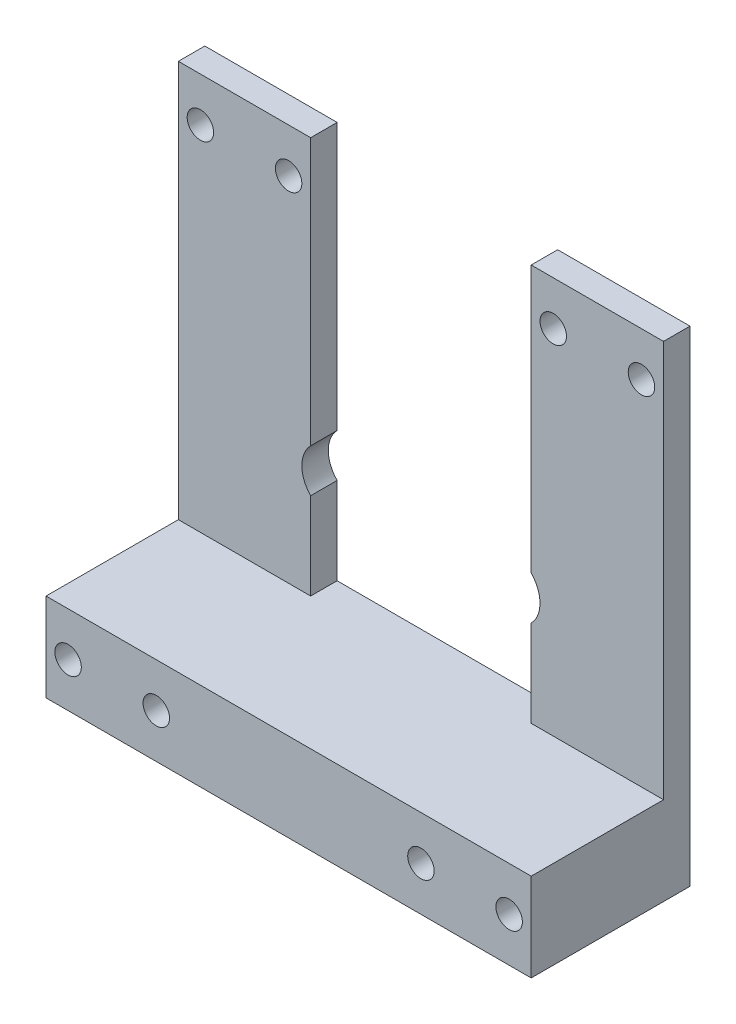
ISO-10303-21;
HEADER;
FILE_DESCRIPTION(('STEP AP214'),'2;1');
FILE_NAME('part.step','',(''),(''),'','','');
FILE_SCHEMA(('AUTOMOTIVE_DESIGN { 1 0 10303 214 1 1 1 1 }'));
ENDSEC;
DATA;
#1=APPLICATION_CONTEXT('core data for automotive mechanical design processes');
#2=APPLICATION_PROTOCOL_DEFINITION('international standard','automotive_design',2000,#1);
#3=PRODUCT_CONTEXT('',#1,'mechanical');
#4=PRODUCT('Part','Part','',(#3));
#5=PRODUCT_RELATED_PRODUCT_CATEGORY('part','',(#4));
#6=PRODUCT_DEFINITION_FORMATION('','',#4);
#7=PRODUCT_DEFINITION_CONTEXT('part definition',#1,'design');
#8=PRODUCT_DEFINITION('design','',#6,#7);
#9=PRODUCT_DEFINITION_SHAPE('','',#8);
#10=(LENGTH_UNIT() NAMED_UNIT(*) SI_UNIT(.MILLI.,.METRE.));
#11=(NAMED_UNIT(*) PLANE_ANGLE_UNIT() SI_UNIT($,.RADIAN.));
#12=(NAMED_UNIT(*) SI_UNIT($,.STERADIAN.) SOLID_ANGLE_UNIT());
#13=UNCERTAINTY_MEASURE_WITH_UNIT(LENGTH_MEASURE(1.E-05),#10,'distance_accuracy_value','');
#14=(GEOMETRIC_REPRESENTATION_CONTEXT(3) GLOBAL_UNCERTAINTY_ASSIGNED_CONTEXT((#13)) GLOBAL_UNIT_ASSIGNED_CONTEXT((#10,
#11,#12)) REPRESENTATION_CONTEXT('',''));
#15=CARTESIAN_POINT('',(0.,0.,0.));
#16=DIRECTION('',(0.,0.,1.));
#17=DIRECTION('',(1.,0.,0.));
#18=AXIS2_PLACEMENT_3D('',#15,#16,#17);
#19=CARTESIAN_POINT('',(0.,0.,15.));
#20=DIRECTION('',(0.,0.,1.));
#21=DIRECTION('',(1.,0.,0.));
#22=AXIS2_PLACEMENT_3D('',#19,#20,#21);
#23=PLANE('',#22);
#24=CARTESIAN_POINT('',(-42.5,5.,15.));
#25=DIRECTION('',(0.,0.,1.));
#26=DIRECTION('',(1.,0.,0.));
#27=AXIS2_PLACEMENT_3D('',#24,#25,#26);
#28=CIRCLE('',#27,1.5);
#29=CARTESIAN_POINT('',(-41.,5.,15.));
#30=VERTEX_POINT('',#29);
#31=EDGE_CURVE('E323',#30,#30,#28,.T.);
#32=ORIENTED_EDGE('',*,*,#31,.F.);
#33=EDGE_LOOP('',(#32));
#34=FACE_BOUND('',#33,.T.);
#35=CARTESIAN_POINT('',(-2.5,4.99999999999983,15.));
#36=DIRECTION('',(0.,0.,1.));
#37=DIRECTION('',(1.,0.,0.));
#38=AXIS2_PLACEMENT_3D('',#35,#36,#37);
#39=CIRCLE('',#38,1.5);
#40=CARTESIAN_POINT('',(-0.999999999999995,4.99999999999983,15.));
#41=VERTEX_POINT('',#40);
#42=EDGE_CURVE('E331',#41,#41,#39,.T.);
#43=ORIENTED_EDGE('',*,*,#42,.F.);
#44=EDGE_LOOP('',(#43));
#45=FACE_BOUND('',#44,.T.);
#46=DIRECTION('',(0.,1.,0.));
#47=VECTOR('',#46,1.);
#48=CARTESIAN_POINT('',(0.,0.,15.));
#49=LINE('',#48,#47);
#50=CARTESIAN_POINT('',(0.,0.,15.));
#51=VERTEX_POINT('',#50);
#52=CARTESIAN_POINT('',(0.,10.,15.));
#53=VERTEX_POINT('',#52);
#54=EDGE_CURVE('E336',#51,#53,#49,.T.);
#55=ORIENTED_EDGE('',*,*,#54,.T.);
#56=DIRECTION('',(-1.,0.,0.));
#57=VECTOR('',#56,1.);
#58=CARTESIAN_POINT('',(0.,10.,15.));
#59=LINE('',#58,#57);
#60=CARTESIAN_POINT('',(-55.,10.,15.));
#61=VERTEX_POINT('',#60);
#62=EDGE_CURVE('E339',#53,#61,#59,.T.);
#63=ORIENTED_EDGE('',*,*,#62,.T.);
#64=DIRECTION('',(0.,-1.,0.));
#65=VECTOR('',#64,1.);
#66=CARTESIAN_POINT('',(-55.,0.,15.));
#67=LINE('',#66,#65);
#68=CARTESIAN_POINT('',(-55.,0.,15.));
#69=VERTEX_POINT('',#68);
#70=EDGE_CURVE('E343',#61,#69,#67,.T.);
#71=ORIENTED_EDGE('',*,*,#70,.T.);
#72=DIRECTION('',(1.,0.,0.));
#73=VECTOR('',#72,1.);
#74=CARTESIAN_POINT('',(0.,0.,15.));
#75=LINE('',#74,#73);
#76=EDGE_CURVE('E68',#69,#51,#75,.T.);
#77=ORIENTED_EDGE('',*,*,#76,.T.);
#78=EDGE_LOOP('',(#55,#63,#71,#77));
#79=FACE_BOUND('',#78,.T.);
#80=CARTESIAN_POINT('',(-12.5,4.9999999999999,15.));
#81=DIRECTION('',(0.,0.,1.));
#82=DIRECTION('',(1.,0.,0.));
#83=AXIS2_PLACEMENT_3D('',#80,#81,#82);
#84=CIRCLE('',#83,1.5);
#85=CARTESIAN_POINT('',(-11.,4.9999999999999,15.));
#86=VERTEX_POINT('',#85);
#87=EDGE_CURVE('E327',#86,#86,#84,.T.);
#88=ORIENTED_EDGE('',*,*,#87,.F.);
#89=EDGE_LOOP('',(#88));
#90=FACE_BOUND('',#89,.T.);
#91=CARTESIAN_POINT('',(-52.5,5.,15.));
#92=DIRECTION('',(0.,0.,1.));
#93=DIRECTION('',(1.,0.,0.));
#94=AXIS2_PLACEMENT_3D('',#91,#92,#93);
#95=CIRCLE('',#94,1.5);
#96=CARTESIAN_POINT('',(-51.,5.,15.));
#97=VERTEX_POINT('',#96);
#98=EDGE_CURVE('E319',#97,#97,#95,.T.);
#99=ORIENTED_EDGE('',*,*,#98,.F.);
#100=EDGE_LOOP('',(#99));
#101=FACE_BOUND('',#100,.T.);
#102=ADVANCED_FACE('F51',(#34,#45,#79,#90,#101),#23,.T.);
#103=CARTESIAN_POINT('',(0.,0.,15.));
#104=DIRECTION('',(-1.,0.,0.));
#105=DIRECTION('',(0.,0.,1.));
#106=AXIS2_PLACEMENT_3D('',#103,#104,#105);
#107=PLANE('',#106);
#108=DIRECTION('',(0.,0.,-1.));
#109=VECTOR('',#108,1.);
#110=CARTESIAN_POINT('',(0.,0.,15.));
#111=LINE('',#110,#109);
#112=CARTESIAN_POINT('',(0.,0.,-3.));
#113=VERTEX_POINT('',#112);
#114=EDGE_CURVE('E157',#51,#113,#111,.T.);
#115=ORIENTED_EDGE('',*,*,#114,.T.);
#116=DIRECTION('',(0.,-1.,0.));
#117=VECTOR('',#116,1.);
#118=CARTESIAN_POINT('',(0.,0.,-3.));
#119=LINE('',#118,#117);
#120=CARTESIAN_POINT('',(0.,54.9999999999979,-3.));
#121=VERTEX_POINT('',#120);
#122=EDGE_CURVE('E175',#121,#113,#119,.T.);
#123=ORIENTED_EDGE('',*,*,#122,.F.);
#124=DIRECTION('',(0.,0.,1.));
#125=VECTOR('',#124,1.);
#126=CARTESIAN_POINT('',(0.,54.9999999999979,-3.));
#127=LINE('',#126,#125);
#128=CARTESIAN_POINT('',(0.,54.9999999999979,0.));
#129=VERTEX_POINT('',#128);
#130=EDGE_CURVE('E246',#121,#129,#127,.T.);
#131=ORIENTED_EDGE('',*,*,#130,.T.);
#132=DIRECTION('',(0.,-1.,0.));
#133=VECTOR('',#132,1.);
#134=CARTESIAN_POINT('',(0.,0.,0.));
#135=LINE('',#134,#133);
#136=CARTESIAN_POINT('',(0.,10.,0.));
#137=VERTEX_POINT('',#136);
#138=EDGE_CURVE('E276',#129,#137,#135,.T.);
#139=ORIENTED_EDGE('',*,*,#138,.T.);
#140=DIRECTION('',(0.,0.,-1.));
#141=VECTOR('',#140,1.);
#142=CARTESIAN_POINT('',(0.,10.,15.));
#143=LINE('',#142,#141);
#144=EDGE_CURVE('E11',#53,#137,#143,.T.);
#145=ORIENTED_EDGE('',*,*,#144,.F.);
#146=ORIENTED_EDGE('',*,*,#54,.F.);
#147=EDGE_LOOP('',(#115,#123,#131,#139,#145,#146));
#148=FACE_BOUND('',#147,.T.);
#149=ADVANCED_FACE('F53',(#148),#107,.F.);
#150=CARTESIAN_POINT('',(0.,10.,15.));
#151=DIRECTION('',(0.,-1.,0.));
#152=DIRECTION('',(1.,0.,0.));
#153=AXIS2_PLACEMENT_3D('',#150,#151,#152);
#154=PLANE('',#153);
#155=DIRECTION('',(-1.,0.,0.));
#156=VECTOR('',#155,1.);
#157=CARTESIAN_POINT('',(0.,10.,0.));
#158=LINE('',#157,#156);
#159=CARTESIAN_POINT('',(-15.0000000000012,10.,0.));
#160=VERTEX_POINT('',#159);
#161=EDGE_CURVE('E340',#137,#160,#158,.T.);
#162=ORIENTED_EDGE('',*,*,#161,.T.);
#163=DIRECTION('',(0.,0.,1.));
#164=VECTOR('',#163,1.);
#165=CARTESIAN_POINT('',(-15.0000000000012,10.,-3.));
#166=LINE('',#165,#164);
#167=CARTESIAN_POINT('',(-15.0000000000012,10.,-3.));
#168=VERTEX_POINT('',#167);
#169=EDGE_CURVE('E301',#168,#160,#166,.T.);
#170=ORIENTED_EDGE('',*,*,#169,.F.);
#171=DIRECTION('',(1.,0.,0.));
#172=VECTOR('',#171,1.);
#173=CARTESIAN_POINT('',(0.,10.,-3.));
#174=LINE('',#173,#172);
#175=CARTESIAN_POINT('',(-40.0000000000012,10.,-3.));
#176=VERTEX_POINT('',#175);
#177=EDGE_CURVE('E198',#176,#168,#174,.T.);
#178=ORIENTED_EDGE('',*,*,#177,.F.);
#179=DIRECTION('',(0.,0.,1.));
#180=VECTOR('',#179,1.);
#181=CARTESIAN_POINT('',(-40.0000000000012,10.,-3.));
#182=LINE('',#181,#180);
#183=CARTESIAN_POINT('',(-40.0000000000012,10.,0.));
#184=VERTEX_POINT('',#183);
#185=EDGE_CURVE('E304',#176,#184,#182,.T.);
#186=ORIENTED_EDGE('',*,*,#185,.T.);
#187=CARTESIAN_POINT('',(-55.,10.,0.));
#188=VERTEX_POINT('',#187);
#189=EDGE_CURVE('E335',#184,#188,#158,.T.);
#190=ORIENTED_EDGE('',*,*,#189,.T.);
#191=DIRECTION('',(0.,0.,-1.));
#192=VECTOR('',#191,1.);
#193=CARTESIAN_POINT('',(-55.,10.,15.));
#194=LINE('',#193,#192);
#195=EDGE_CURVE('E61',#61,#188,#194,.T.);
#196=ORIENTED_EDGE('',*,*,#195,.F.);
#197=ORIENTED_EDGE('',*,*,#62,.F.);
#198=ORIENTED_EDGE('',*,*,#144,.T.);
#199=EDGE_LOOP('',(#162,#170,#178,#186,#190,#196,#197,#198));
#200=FACE_BOUND('',#199,.T.);
#201=ADVANCED_FACE('F359',(#200),#154,.F.);
#202=CARTESIAN_POINT('',(-55.,0.,15.));
#203=DIRECTION('',(1.,0.,0.));
#204=DIRECTION('',(0.,0.,-1.));
#205=AXIS2_PLACEMENT_3D('',#202,#203,#204);
#206=PLANE('',#205);
#207=ORIENTED_EDGE('',*,*,#195,.T.);
#208=DIRECTION('',(0.,1.,0.));
#209=VECTOR('',#208,1.);
#210=CARTESIAN_POINT('',(-55.,0.,0.));
#211=LINE('',#210,#209);
#212=CARTESIAN_POINT('',(-55.,54.9999999999974,0.));
#213=VERTEX_POINT('',#212);
#214=EDGE_CURVE('E247',#188,#213,#211,.T.);
#215=ORIENTED_EDGE('',*,*,#214,.T.);
#216=DIRECTION('',(0.,0.,1.));
#217=VECTOR('',#216,1.);
#218=CARTESIAN_POINT('',(-55.,54.9999999999974,-3.));
#219=LINE('',#218,#217);
#220=CARTESIAN_POINT('',(-55.,54.9999999999974,-3.));
#221=VERTEX_POINT('',#220);
#222=EDGE_CURVE('E164',#221,#213,#219,.T.);
#223=ORIENTED_EDGE('',*,*,#222,.F.);
#224=DIRECTION('',(0.,1.,0.));
#225=VECTOR('',#224,1.);
#226=CARTESIAN_POINT('',(-55.,0.,-3.));
#227=LINE('',#226,#225);
#228=CARTESIAN_POINT('',(-55.,0.,-3.));
#229=VERTEX_POINT('',#228);
#230=EDGE_CURVE('E160',#229,#221,#227,.T.);
#231=ORIENTED_EDGE('',*,*,#230,.F.);
#232=DIRECTION('',(0.,0.,-1.));
#233=VECTOR('',#232,1.);
#234=CARTESIAN_POINT('',(-55.,0.,15.));
#235=LINE('',#234,#233);
#236=EDGE_CURVE('E149',#69,#229,#235,.T.);
#237=ORIENTED_EDGE('',*,*,#236,.F.);
#238=ORIENTED_EDGE('',*,*,#70,.F.);
#239=EDGE_LOOP('',(#207,#215,#223,#231,#237,#238));
#240=FACE_BOUND('',#239,.T.);
#241=ADVANCED_FACE('F162',(#240),#206,.F.);
#242=CARTESIAN_POINT('',(0.,0.,15.));
#243=DIRECTION('',(0.,1.,0.));
#244=DIRECTION('',(0.,0.,1.));
#245=AXIS2_PLACEMENT_3D('',#242,#243,#244);
#246=PLANE('',#245);
#247=ORIENTED_EDGE('',*,*,#236,.T.);
#248=DIRECTION('',(-1.,0.,0.));
#249=VECTOR('',#248,1.);
#250=CARTESIAN_POINT('',(0.,0.,-3.));
#251=LINE('',#250,#249);
#252=EDGE_CURVE('E153',#113,#229,#251,.T.);
#253=ORIENTED_EDGE('',*,*,#252,.F.);
#254=ORIENTED_EDGE('',*,*,#114,.F.);
#255=ORIENTED_EDGE('',*,*,#76,.F.);
#256=EDGE_LOOP('',(#247,#253,#254,#255));
#257=FACE_BOUND('',#256,.T.);
#258=ADVANCED_FACE('F151',(#257),#246,.F.);
#259=CARTESIAN_POINT('',(-2.5,4.99999999999983,15.));
#260=DIRECTION('',(0.,0.,-1.));
#261=DIRECTION('',(-1.,0.,0.));
#262=AXIS2_PLACEMENT_3D('',#259,#260,#261);
#263=CYLINDRICAL_SURFACE('',#262,1.5);
#264=ORIENTED_EDGE('',*,*,#42,.T.);
#265=EDGE_LOOP('',(#264));
#266=FACE_BOUND('',#265,.T.);
#267=CARTESIAN_POINT('',(-2.5,4.99999999999983,-3.));
#268=DIRECTION('',(0.,0.,-1.));
#269=DIRECTION('',(-1.,0.,0.));
#270=AXIS2_PLACEMENT_3D('',#267,#268,#269);
#271=CIRCLE('',#270,1.5);
#272=CARTESIAN_POINT('',(-4.,4.99999999999983,-3.));
#273=VERTEX_POINT('',#272);
#274=EDGE_CURVE('E219',#273,#273,#271,.F.);
#275=ORIENTED_EDGE('',*,*,#274,.F.);
#276=EDGE_LOOP('',(#275));
#277=FACE_BOUND('',#276,.T.);
#278=ADVANCED_FACE('F526',(#266,#277),#263,.F.);
#279=CARTESIAN_POINT('',(-12.5,4.9999999999999,15.));
#280=DIRECTION('',(0.,0.,-1.));
#281=DIRECTION('',(-1.,0.,0.));
#282=AXIS2_PLACEMENT_3D('',#279,#280,#281);
#283=CYLINDRICAL_SURFACE('',#282,1.5);
#284=ORIENTED_EDGE('',*,*,#87,.T.);
#285=EDGE_LOOP('',(#284));
#286=FACE_BOUND('',#285,.T.);
#287=CARTESIAN_POINT('',(-12.5,4.9999999999999,-3.));
#288=DIRECTION('',(0.,0.,-1.));
#289=DIRECTION('',(-1.,0.,0.));
#290=AXIS2_PLACEMENT_3D('',#287,#288,#289);
#291=CIRCLE('',#290,1.5);
#292=CARTESIAN_POINT('',(-14.,4.9999999999999,-3.));
#293=VERTEX_POINT('',#292);
#294=EDGE_CURVE('E215',#293,#293,#291,.F.);
#295=ORIENTED_EDGE('',*,*,#294,.F.);
#296=EDGE_LOOP('',(#295));
#297=FACE_BOUND('',#296,.T.);
#298=ADVANCED_FACE('F522',(#286,#297),#283,.F.);
#299=CARTESIAN_POINT('',(-42.5,5.,15.));
#300=DIRECTION('',(0.,0.,-1.));
#301=DIRECTION('',(-1.,0.,0.));
#302=AXIS2_PLACEMENT_3D('',#299,#300,#301);
#303=CYLINDRICAL_SURFACE('',#302,1.5);
#304=ORIENTED_EDGE('',*,*,#31,.T.);
#305=EDGE_LOOP('',(#304));
#306=FACE_BOUND('',#305,.T.);
#307=CARTESIAN_POINT('',(-42.5,5.,-3.));
#308=DIRECTION('',(0.,0.,-1.));
#309=DIRECTION('',(-1.,0.,0.));
#310=AXIS2_PLACEMENT_3D('',#307,#308,#309);
#311=CIRCLE('',#310,1.5);
#312=CARTESIAN_POINT('',(-44.,5.,-3.));
#313=VERTEX_POINT('',#312);
#314=EDGE_CURVE('E223',#313,#313,#311,.F.);
#315=ORIENTED_EDGE('',*,*,#314,.F.);
#316=EDGE_LOOP('',(#315));
#317=FACE_BOUND('',#316,.T.);
#318=ADVANCED_FACE('F451',(#306,#317),#303,.F.);
#319=CARTESIAN_POINT('',(-52.5,5.,15.));
#320=DIRECTION('',(0.,0.,-1.));
#321=DIRECTION('',(-1.,0.,0.));
#322=AXIS2_PLACEMENT_3D('',#319,#320,#321);
#323=CYLINDRICAL_SURFACE('',#322,1.5);
#324=ORIENTED_EDGE('',*,*,#98,.T.);
#325=EDGE_LOOP('',(#324));
#326=FACE_BOUND('',#325,.T.);
#327=CARTESIAN_POINT('',(-52.5,5.,-3.));
#328=DIRECTION('',(0.,0.,-1.));
#329=DIRECTION('',(-1.,0.,0.));
#330=AXIS2_PLACEMENT_3D('',#327,#328,#329);
#331=CIRCLE('',#330,1.5);
#332=CARTESIAN_POINT('',(-54.,5.,-3.));
#333=VERTEX_POINT('',#332);
#334=EDGE_CURVE('E226',#333,#333,#331,.F.);
#335=ORIENTED_EDGE('',*,*,#334,.F.);
#336=EDGE_LOOP('',(#335));
#337=FACE_BOUND('',#336,.T.);
#338=ADVANCED_FACE('F447',(#326,#337),#323,.F.);
#339=CARTESIAN_POINT('',(0.,0.,0.));
#340=DIRECTION('',(0.,0.,-1.));
#341=DIRECTION('',(-1.,0.,0.));
#342=AXIS2_PLACEMENT_3D('',#339,#340,#341);
#343=PLANE('',#342);
#344=ORIENTED_EDGE('',*,*,#161,.F.);
#345=ORIENTED_EDGE('',*,*,#138,.F.);
#346=DIRECTION('',(-1.,0.,0.));
#347=VECTOR('',#346,1.);
#348=CARTESIAN_POINT('',(0.,54.9999999999979,0.));
#349=LINE('',#348,#347);
#350=CARTESIAN_POINT('',(-15.0000000000012,54.9999999999979,0.));
#351=VERTEX_POINT('',#350);
#352=EDGE_CURVE('E272',#129,#351,#349,.T.);
#353=ORIENTED_EDGE('',*,*,#352,.T.);
#354=DIRECTION('',(0.,1.,0.));
#355=VECTOR('',#354,1.);
#356=CARTESIAN_POINT('',(-15.0000000000012,0.,0.));
#357=LINE('',#356,#355);
#358=CARTESIAN_POINT('',(-15.0000000000012,24.7495199595706,0.));
#359=VERTEX_POINT('',#358);
#360=EDGE_CURVE('E268',#359,#351,#357,.T.);
#361=ORIENTED_EDGE('',*,*,#360,.F.);
#362=CARTESIAN_POINT('',(-17.5000000000221,22.3000302168392,0.));
#363=DIRECTION('',(0.,0.,-1.));
#364=DIRECTION('',(-1.,0.,0.));
#365=AXIS2_PLACEMENT_3D('',#362,#363,#364);
#366=CIRCLE('',#365,3.4999999999787);
#367=CARTESIAN_POINT('',(-15.0000000000012,19.8505404741079,0.));
#368=VERTEX_POINT('',#367);
#369=EDGE_CURVE('E267',#359,#368,#366,.T.);
#370=ORIENTED_EDGE('',*,*,#369,.T.);
#371=EDGE_CURVE('E263',#160,#368,#357,.T.);
#372=ORIENTED_EDGE('',*,*,#371,.F.);
#373=EDGE_LOOP('',(#344,#345,#353,#361,#370,#372));
#374=FACE_BOUND('',#373,.T.);
#375=CARTESIAN_POINT('',(-12.5000000000011,49.9999999999979,0.));
#376=DIRECTION('',(0.,0.,-1.));
#377=DIRECTION('',(-1.,0.,0.));
#378=AXIS2_PLACEMENT_3D('',#375,#376,#377);
#379=CIRCLE('',#378,1.5);
#380=CARTESIAN_POINT('',(-14.0000000000011,49.9999999999979,0.));
#381=VERTEX_POINT('',#380);
#382=EDGE_CURVE('E284',#381,#381,#379,.T.);
#383=ORIENTED_EDGE('',*,*,#382,.T.);
#384=EDGE_LOOP('',(#383));
#385=FACE_BOUND('',#384,.T.);
#386=CARTESIAN_POINT('',(-2.5000000000011,49.9999999999981,0.));
#387=DIRECTION('',(0.,0.,-1.));
#388=DIRECTION('',(-1.,0.,0.));
#389=AXIS2_PLACEMENT_3D('',#386,#387,#388);
#390=CIRCLE('',#389,1.5);
#391=CARTESIAN_POINT('',(-4.0000000000011,49.9999999999981,0.));
#392=VERTEX_POINT('',#391);
#393=EDGE_CURVE('E280',#392,#392,#390,.T.);
#394=ORIENTED_EDGE('',*,*,#393,.T.);
#395=EDGE_LOOP('',(#394));
#396=FACE_BOUND('',#395,.T.);
#397=ADVANCED_FACE('F450',(#374,#385,#396),#343,.F.);
#398=CARTESIAN_POINT('',(0.,54.9999999999974,-3.));
#399=DIRECTION('',(0.,-1.,0.));
#400=DIRECTION('',(0.,0.,-1.));
#401=AXIS2_PLACEMENT_3D('',#398,#399,#400);
#402=PLANE('',#401);
#403=DIRECTION('',(1.,0.,0.));
#404=VECTOR('',#403,1.);
#405=CARTESIAN_POINT('',(0.,54.9999999999974,0.));
#406=LINE('',#405,#404);
#407=CARTESIAN_POINT('',(-40.0000000000012,54.9999999999974,0.));
#408=VERTEX_POINT('',#407);
#409=EDGE_CURVE('E250',#213,#408,#406,.T.);
#410=ORIENTED_EDGE('',*,*,#409,.T.);
#411=DIRECTION('',(0.,0.,1.));
#412=VECTOR('',#411,1.);
#413=CARTESIAN_POINT('',(-40.0000000000012,54.9999999999974,-3.));
#414=LINE('',#413,#412);
#415=CARTESIAN_POINT('',(-40.0000000000012,54.9999999999974,-3.));
#416=VERTEX_POINT('',#415);
#417=EDGE_CURVE('E314',#416,#408,#414,.T.);
#418=ORIENTED_EDGE('',*,*,#417,.F.);
#419=DIRECTION('',(1.,0.,0.));
#420=VECTOR('',#419,1.);
#421=CARTESIAN_POINT('',(0.,54.9999999999974,-3.));
#422=LINE('',#421,#420);
#423=EDGE_CURVE('E168',#221,#416,#422,.T.);
#424=ORIENTED_EDGE('',*,*,#423,.F.);
#425=ORIENTED_EDGE('',*,*,#222,.T.);
#426=EDGE_LOOP('',(#410,#418,#424,#425));
#427=FACE_BOUND('',#426,.T.);
#428=ADVANCED_FACE('F479',(#427),#402,.F.);
#429=CARTESIAN_POINT('',(-40.0000000000012,0.,-3.));
#430=DIRECTION('',(1.,0.,0.));
#431=DIRECTION('',(0.,0.,-1.));
#432=AXIS2_PLACEMENT_3D('',#429,#430,#431);
#433=PLANE('',#432);
#434=DIRECTION('',(0.,1.,0.));
#435=VECTOR('',#434,1.);
#436=CARTESIAN_POINT('',(-40.0000000000012,0.,0.));
#437=LINE('',#436,#435);
#438=CARTESIAN_POINT('',(-40.0000000000012,24.7495199595687,0.));
#439=VERTEX_POINT('',#438);
#440=EDGE_CURVE('E254',#439,#408,#437,.T.);
#441=ORIENTED_EDGE('',*,*,#440,.F.);
#442=DIRECTION('',(0.,0.,1.));
#443=VECTOR('',#442,1.);
#444=CARTESIAN_POINT('',(-40.0000000000012,24.7495199595687,-3.));
#445=LINE('',#444,#443);
#446=CARTESIAN_POINT('',(-40.0000000000012,24.7495199595687,-3.));
#447=VERTEX_POINT('',#446);
#448=EDGE_CURVE('E311',#447,#439,#445,.T.);
#449=ORIENTED_EDGE('',*,*,#448,.F.);
#450=DIRECTION('',(0.,1.,0.));
#451=VECTOR('',#450,1.);
#452=CARTESIAN_POINT('',(-40.0000000000012,0.,-3.));
#453=LINE('',#452,#451);
#454=EDGE_CURVE('E189',#447,#416,#453,.T.);
#455=ORIENTED_EDGE('',*,*,#454,.T.);
#456=ORIENTED_EDGE('',*,*,#417,.T.);
#457=EDGE_LOOP('',(#441,#449,#455,#456));
#458=FACE_BOUND('',#457,.T.);
#459=ADVANCED_FACE('F483',(#458),#433,.T.);
#460=CARTESIAN_POINT('',(-37.499999999979,22.3000302168389,-3.));
#461=DIRECTION('',(0.,0.,1.));
#462=DIRECTION('',(1.,0.,0.));
#463=AXIS2_PLACEMENT_3D('',#460,#461,#462);
#464=CYLINDRICAL_SURFACE('',#463,3.49999999997849);
#465=CARTESIAN_POINT('',(-37.499999999979,22.3000302168389,0.));
#466=DIRECTION('',(0.,0.,-1.));
#467=DIRECTION('',(-1.,0.,0.));
#468=AXIS2_PLACEMENT_3D('',#465,#466,#467);
#469=CIRCLE('',#468,3.49999999997849);
#470=CARTESIAN_POINT('',(-40.0000000000012,19.850540474109,0.));
#471=VERTEX_POINT('',#470);
#472=EDGE_CURVE('E258',#471,#439,#469,.T.);
#473=ORIENTED_EDGE('',*,*,#472,.F.);
#474=DIRECTION('',(0.,0.,1.));
#475=VECTOR('',#474,1.);
#476=CARTESIAN_POINT('',(-40.0000000000012,19.850540474109,-3.));
#477=LINE('',#476,#475);
#478=CARTESIAN_POINT('',(-40.0000000000012,19.850540474109,-3.));
#479=VERTEX_POINT('',#478);
#480=EDGE_CURVE('E308',#479,#471,#477,.T.);
#481=ORIENTED_EDGE('',*,*,#480,.F.);
#482=CARTESIAN_POINT('',(-37.499999999979,22.3000302168389,-3.));
#483=DIRECTION('',(0.,0.,-1.));
#484=DIRECTION('',(-1.,0.,0.));
#485=AXIS2_PLACEMENT_3D('',#482,#483,#484);
#486=CIRCLE('',#485,3.49999999997849);
#487=EDGE_CURVE('E193',#479,#447,#486,.T.);
#488=ORIENTED_EDGE('',*,*,#487,.T.);
#489=ORIENTED_EDGE('',*,*,#448,.T.);
#490=EDGE_LOOP('',(#473,#481,#488,#489));
#491=FACE_BOUND('',#490,.T.);
#492=ADVANCED_FACE('F515',(#491),#464,.F.);
#493=EDGE_CURVE('E259',#184,#471,#437,.T.);
#494=ORIENTED_EDGE('',*,*,#493,.F.);
#495=ORIENTED_EDGE('',*,*,#185,.F.);
#496=EDGE_CURVE('E194',#176,#479,#453,.T.);
#497=ORIENTED_EDGE('',*,*,#496,.T.);
#498=ORIENTED_EDGE('',*,*,#480,.T.);
#499=EDGE_LOOP('',(#494,#495,#497,#498));
#500=FACE_BOUND('',#499,.T.);
#501=ADVANCED_FACE('F512',(#500),#433,.T.);
#502=CARTESIAN_POINT('',(-15.0000000000012,0.,-3.));
#503=DIRECTION('',(1.,0.,0.));
#504=DIRECTION('',(0.,0.,-1.));
#505=AXIS2_PLACEMENT_3D('',#502,#503,#504);
#506=PLANE('',#505);
#507=ORIENTED_EDGE('',*,*,#371,.T.);
#508=DIRECTION('',(0.,0.,1.));
#509=VECTOR('',#508,1.);
#510=CARTESIAN_POINT('',(-15.0000000000012,19.8505404741079,-3.));
#511=LINE('',#510,#509);
#512=CARTESIAN_POINT('',(-15.0000000000012,19.8505404741079,-3.));
#513=VERTEX_POINT('',#512);
#514=EDGE_CURVE('E298',#513,#368,#511,.T.);
#515=ORIENTED_EDGE('',*,*,#514,.F.);
#516=DIRECTION('',(0.,1.,0.));
#517=VECTOR('',#516,1.);
#518=CARTESIAN_POINT('',(-15.0000000000012,0.,-3.));
#519=LINE('',#518,#517);
#520=EDGE_CURVE('E201',#168,#513,#519,.T.);
#521=ORIENTED_EDGE('',*,*,#520,.F.);
#522=ORIENTED_EDGE('',*,*,#169,.T.);
#523=EDGE_LOOP('',(#507,#515,#521,#522));
#524=FACE_BOUND('',#523,.T.);
#525=ADVANCED_FACE('F508',(#524),#506,.F.);
#526=CARTESIAN_POINT('',(-17.5000000000221,22.3000302168392,-3.));
#527=DIRECTION('',(0.,0.,1.));
#528=DIRECTION('',(1.,0.,0.));
#529=AXIS2_PLACEMENT_3D('',#526,#527,#528);
#530=CYLINDRICAL_SURFACE('',#529,3.4999999999787);
#531=ORIENTED_EDGE('',*,*,#369,.F.);
#532=DIRECTION('',(0.,0.,1.));
#533=VECTOR('',#532,1.);
#534=CARTESIAN_POINT('',(-15.0000000000012,24.7495199595706,-3.));
#535=LINE('',#534,#533);
#536=CARTESIAN_POINT('',(-15.0000000000012,24.7495199595706,-3.));
#537=VERTEX_POINT('',#536);
#538=EDGE_CURVE('E295',#537,#359,#535,.T.);
#539=ORIENTED_EDGE('',*,*,#538,.F.);
#540=CARTESIAN_POINT('',(-17.5000000000221,22.3000302168392,-3.));
#541=DIRECTION('',(0.,0.,-1.));
#542=DIRECTION('',(-1.,0.,0.));
#543=AXIS2_PLACEMENT_3D('',#540,#541,#542);
#544=CIRCLE('',#543,3.4999999999787);
#545=EDGE_CURVE('E204',#537,#513,#544,.T.);
#546=ORIENTED_EDGE('',*,*,#545,.T.);
#547=ORIENTED_EDGE('',*,*,#514,.T.);
#548=EDGE_LOOP('',(#531,#539,#546,#547));
#549=FACE_BOUND('',#548,.T.);
#550=ADVANCED_FACE('F507',(#549),#530,.F.);
#551=ORIENTED_EDGE('',*,*,#360,.T.);
#552=DIRECTION('',(0.,0.,1.));
#553=VECTOR('',#552,1.);
#554=CARTESIAN_POINT('',(-15.0000000000012,54.9999999999979,-3.));
#555=LINE('',#554,#553);
#556=CARTESIAN_POINT('',(-15.0000000000012,54.9999999999979,-3.));
#557=VERTEX_POINT('',#556);
#558=EDGE_CURVE('E292',#557,#351,#555,.T.);
#559=ORIENTED_EDGE('',*,*,#558,.F.);
#560=EDGE_CURVE('E205',#537,#557,#519,.T.);
#561=ORIENTED_EDGE('',*,*,#560,.F.);
#562=ORIENTED_EDGE('',*,*,#538,.T.);
#563=EDGE_LOOP('',(#551,#559,#561,#562));
#564=FACE_BOUND('',#563,.T.);
#565=ADVANCED_FACE('F430',(#564),#506,.F.);
#566=CARTESIAN_POINT('',(0.,54.9999999999979,-3.));
#567=DIRECTION('',(0.,1.,0.));
#568=DIRECTION('',(0.,0.,1.));
#569=AXIS2_PLACEMENT_3D('',#566,#567,#568);
#570=PLANE('',#569);
#571=ORIENTED_EDGE('',*,*,#352,.F.);
#572=ORIENTED_EDGE('',*,*,#130,.F.);
#573=DIRECTION('',(-1.,0.,0.));
#574=VECTOR('',#573,1.);
#575=CARTESIAN_POINT('',(0.,54.9999999999979,-3.));
#576=LINE('',#575,#574);
#577=EDGE_CURVE('E209',#121,#557,#576,.T.);
#578=ORIENTED_EDGE('',*,*,#577,.T.);
#579=ORIENTED_EDGE('',*,*,#558,.T.);
#580=EDGE_LOOP('',(#571,#572,#578,#579));
#581=FACE_BOUND('',#580,.T.);
#582=ADVANCED_FACE('F434',(#581),#570,.T.);
#583=CARTESIAN_POINT('',(-42.5000000000011,49.9999999999975,-3.));
#584=DIRECTION('',(0.,0.,1.));
#585=DIRECTION('',(1.,0.,0.));
#586=AXIS2_PLACEMENT_3D('',#583,#584,#585);
#587=CYLINDRICAL_SURFACE('',#586,1.5);
#588=CARTESIAN_POINT('',(-42.5000000000011,49.9999999999975,-3.));
#589=DIRECTION('',(0.,0.,-1.));
#590=DIRECTION('',(-1.,0.,0.));
#591=AXIS2_PLACEMENT_3D('',#588,#589,#590);
#592=CIRCLE('',#591,1.5);
#593=CARTESIAN_POINT('',(-44.0000000000011,49.9999999999975,-3.));
#594=VERTEX_POINT('',#593);
#595=EDGE_CURVE('E238',#594,#594,#592,.T.);
#596=ORIENTED_EDGE('',*,*,#595,.T.);
#597=EDGE_LOOP('',(#596));
#598=FACE_BOUND('',#597,.T.);
#599=CARTESIAN_POINT('',(-42.5000000000011,49.9999999999975,0.));
#600=DIRECTION('',(0.,0.,-1.));
#601=DIRECTION('',(-1.,0.,0.));
#602=AXIS2_PLACEMENT_3D('',#599,#600,#601);
#603=CIRCLE('',#602,1.5);
#604=CARTESIAN_POINT('',(-44.0000000000011,49.9999999999975,0.));
#605=VERTEX_POINT('',#604);
#606=EDGE_CURVE('E184',#605,#605,#603,.T.);
#607=ORIENTED_EDGE('',*,*,#606,.F.);
#608=EDGE_LOOP('',(#607));
#609=FACE_BOUND('',#608,.T.);
#610=ADVANCED_FACE('F498',(#598,#609),#587,.F.);
#611=CARTESIAN_POINT('',(-12.5000000000011,49.9999999999979,-3.));
#612=DIRECTION('',(0.,0.,1.));
#613=DIRECTION('',(1.,0.,0.));
#614=AXIS2_PLACEMENT_3D('',#611,#612,#613);
#615=CYLINDRICAL_SURFACE('',#614,1.5);
#616=CARTESIAN_POINT('',(-12.5000000000011,49.9999999999979,-3.));
#617=DIRECTION('',(0.,0.,-1.));
#618=DIRECTION('',(-1.,0.,0.));
#619=AXIS2_PLACEMENT_3D('',#616,#617,#618);
#620=CIRCLE('',#619,1.5);
#621=CARTESIAN_POINT('',(-14.0000000000011,49.9999999999979,-3.));
#622=VERTEX_POINT('',#621);
#623=EDGE_CURVE('E234',#622,#622,#620,.T.);
#624=ORIENTED_EDGE('',*,*,#623,.T.);
#625=EDGE_LOOP('',(#624));
#626=FACE_BOUND('',#625,.T.);
#627=ORIENTED_EDGE('',*,*,#382,.F.);
#628=EDGE_LOOP('',(#627));
#629=FACE_BOUND('',#628,.T.);
#630=ADVANCED_FACE('F493',(#626,#629),#615,.F.);
#631=CARTESIAN_POINT('',(-2.5000000000011,49.9999999999981,-3.));
#632=DIRECTION('',(0.,0.,1.));
#633=DIRECTION('',(1.,0.,0.));
#634=AXIS2_PLACEMENT_3D('',#631,#632,#633);
#635=CYLINDRICAL_SURFACE('',#634,1.5);
#636=CARTESIAN_POINT('',(-2.5000000000011,49.9999999999981,-3.));
#637=DIRECTION('',(0.,0.,-1.));
#638=DIRECTION('',(-1.,0.,0.));
#639=AXIS2_PLACEMENT_3D('',#636,#637,#638);
#640=CIRCLE('',#639,1.5);
#641=CARTESIAN_POINT('',(-4.0000000000011,49.9999999999981,-3.));
#642=VERTEX_POINT('',#641);
#643=EDGE_CURVE('E230',#642,#642,#640,.T.);
#644=ORIENTED_EDGE('',*,*,#643,.T.);
#645=EDGE_LOOP('',(#644));
#646=FACE_BOUND('',#645,.T.);
#647=ORIENTED_EDGE('',*,*,#393,.F.);
#648=EDGE_LOOP('',(#647));
#649=FACE_BOUND('',#648,.T.);
#650=ADVANCED_FACE('F470',(#646,#649),#635,.F.);
#651=CARTESIAN_POINT('',(-52.5000000000011,49.9999999999973,-3.));
#652=DIRECTION('',(0.,0.,1.));
#653=DIRECTION('',(1.,0.,0.));
#654=AXIS2_PLACEMENT_3D('',#651,#652,#653);
#655=CYLINDRICAL_SURFACE('',#654,1.5);
#656=CARTESIAN_POINT('',(-52.5000000000011,49.9999999999973,-3.));
#657=DIRECTION('',(0.,0.,-1.));
#658=DIRECTION('',(-1.,0.,0.));
#659=AXIS2_PLACEMENT_3D('',#656,#657,#658);
#660=CIRCLE('',#659,1.5);
#661=CARTESIAN_POINT('',(-54.0000000000011,49.9999999999973,-3.));
#662=VERTEX_POINT('',#661);
#663=EDGE_CURVE('E242',#662,#662,#660,.T.);
#664=ORIENTED_EDGE('',*,*,#663,.T.);
#665=EDGE_LOOP('',(#664));
#666=FACE_BOUND('',#665,.T.);
#667=CARTESIAN_POINT('',(-52.5000000000011,49.9999999999973,0.));
#668=DIRECTION('',(0.,0.,-1.));
#669=DIRECTION('',(-1.,0.,0.));
#670=AXIS2_PLACEMENT_3D('',#667,#668,#669);
#671=CIRCLE('',#670,1.5);
#672=CARTESIAN_POINT('',(-54.0000000000011,49.9999999999973,0.));
#673=VERTEX_POINT('',#672);
#674=EDGE_CURVE('E177',#673,#673,#671,.T.);
#675=ORIENTED_EDGE('',*,*,#674,.F.);
#676=EDGE_LOOP('',(#675));
#677=FACE_BOUND('',#676,.T.);
#678=ADVANCED_FACE('F458',(#666,#677),#655,.F.);
#679=CARTESIAN_POINT('',(0.,0.,-3.));
#680=DIRECTION('',(0.,0.,-1.));
#681=DIRECTION('',(-1.,0.,0.));
#682=AXIS2_PLACEMENT_3D('',#679,#680,#681);
#683=PLANE('',#682);
#684=ORIENTED_EDGE('',*,*,#252,.T.);
#685=ORIENTED_EDGE('',*,*,#230,.T.);
#686=ORIENTED_EDGE('',*,*,#423,.T.);
#687=ORIENTED_EDGE('',*,*,#454,.F.);
#688=ORIENTED_EDGE('',*,*,#487,.F.);
#689=ORIENTED_EDGE('',*,*,#496,.F.);
#690=ORIENTED_EDGE('',*,*,#177,.T.);
#691=ORIENTED_EDGE('',*,*,#520,.T.);
#692=ORIENTED_EDGE('',*,*,#545,.F.);
#693=ORIENTED_EDGE('',*,*,#560,.T.);
#694=ORIENTED_EDGE('',*,*,#577,.F.);
#695=ORIENTED_EDGE('',*,*,#122,.T.);
#696=EDGE_LOOP('',(#684,#685,#686,#687,#688,#689,#690,#691,#692,#693,#694,#695));
#697=FACE_BOUND('',#696,.T.);
#698=ORIENTED_EDGE('',*,*,#294,.T.);
#699=EDGE_LOOP('',(#698));
#700=FACE_BOUND('',#699,.T.);
#701=ORIENTED_EDGE('',*,*,#274,.T.);
#702=EDGE_LOOP('',(#701));
#703=FACE_BOUND('',#702,.T.);
#704=ORIENTED_EDGE('',*,*,#314,.T.);
#705=EDGE_LOOP('',(#704));
#706=FACE_BOUND('',#705,.T.);
#707=ORIENTED_EDGE('',*,*,#334,.T.);
#708=EDGE_LOOP('',(#707));
#709=FACE_BOUND('',#708,.T.);
#710=ORIENTED_EDGE('',*,*,#643,.F.);
#711=EDGE_LOOP('',(#710));
#712=FACE_BOUND('',#711,.T.);
#713=ORIENTED_EDGE('',*,*,#623,.F.);
#714=EDGE_LOOP('',(#713));
#715=FACE_BOUND('',#714,.T.);
#716=ORIENTED_EDGE('',*,*,#595,.F.);
#717=EDGE_LOOP('',(#716));
#718=FACE_BOUND('',#717,.T.);
#719=ORIENTED_EDGE('',*,*,#663,.F.);
#720=EDGE_LOOP('',(#719));
#721=FACE_BOUND('',#720,.T.);
#722=ADVANCED_FACE('F171',(#697,#700,#703,#706,#709,#712,#715,#718,#721),#683,.T.);
#723=ORIENTED_EDGE('',*,*,#189,.F.);
#724=ORIENTED_EDGE('',*,*,#493,.T.);
#725=ORIENTED_EDGE('',*,*,#472,.T.);
#726=ORIENTED_EDGE('',*,*,#440,.T.);
#727=ORIENTED_EDGE('',*,*,#409,.F.);
#728=ORIENTED_EDGE('',*,*,#214,.F.);
#729=EDGE_LOOP('',(#723,#724,#725,#726,#727,#728));
#730=FACE_BOUND('',#729,.T.);
#731=ORIENTED_EDGE('',*,*,#606,.T.);
#732=EDGE_LOOP('',(#731));
#733=FACE_BOUND('',#732,.T.);
#734=ORIENTED_EDGE('',*,*,#674,.T.);
#735=EDGE_LOOP('',(#734));
#736=FACE_BOUND('',#735,.T.);
#737=ADVANCED_FACE('F457',(#730,#733,#736),#343,.F.);
#738=CLOSED_SHELL('',(#102,#149,#201,#241,#258,#278,#298,#318,#338,#397,#428,#459,#492,#501,
#525,#550,#565,#582,#610,#630,#650,#678,#722,#737));
#739=MANIFOLD_SOLID_BREP('B2',#738);
#740=ADVANCED_BREP_SHAPE_REPRESENTATION('',(#18,#739),#14);
#741=SHAPE_DEFINITION_REPRESENTATION(#9,#740);
ENDSEC;
END-ISO-10303-21;
